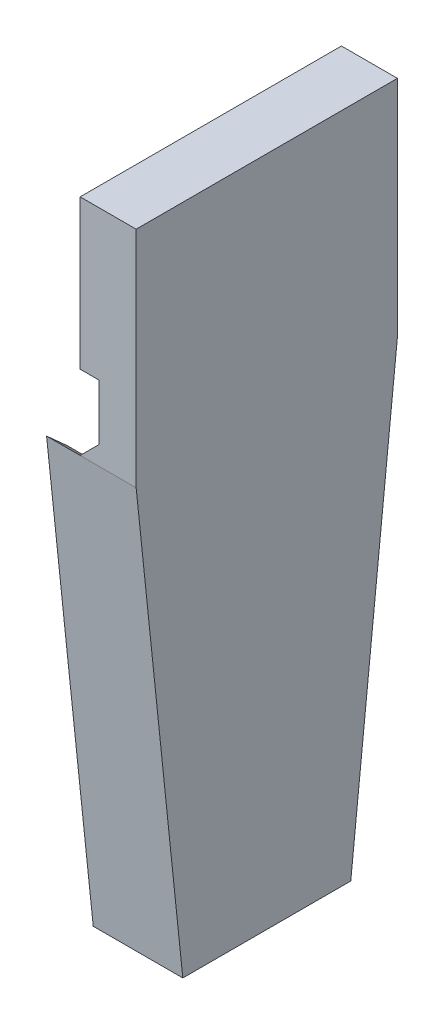
ISO-10303-21;
HEADER;
FILE_DESCRIPTION(('STEP AP214'),'2;1');
FILE_NAME('part.step','',(''),(''),'','','');
FILE_SCHEMA(('AUTOMOTIVE_DESIGN { 1 0 10303 214 1 1 1 1 }'));
ENDSEC;
DATA;
#1=APPLICATION_CONTEXT('core data for automotive mechanical design processes');
#2=APPLICATION_PROTOCOL_DEFINITION('international standard','automotive_design',2000,#1);
#3=PRODUCT_CONTEXT('',#1,'mechanical');
#4=PRODUCT('Part','Part','',(#3));
#5=PRODUCT_RELATED_PRODUCT_CATEGORY('part','',(#4));
#6=PRODUCT_DEFINITION_FORMATION('','',#4);
#7=PRODUCT_DEFINITION_CONTEXT('part definition',#1,'design');
#8=PRODUCT_DEFINITION('design','',#6,#7);
#9=PRODUCT_DEFINITION_SHAPE('','',#8);
#10=(LENGTH_UNIT() NAMED_UNIT(*) SI_UNIT(.MILLI.,.METRE.));
#11=(NAMED_UNIT(*) PLANE_ANGLE_UNIT() SI_UNIT($,.RADIAN.));
#12=(NAMED_UNIT(*) SI_UNIT($,.STERADIAN.) SOLID_ANGLE_UNIT());
#13=UNCERTAINTY_MEASURE_WITH_UNIT(LENGTH_MEASURE(1.E-05),#10,'distance_accuracy_value','');
#14=(GEOMETRIC_REPRESENTATION_CONTEXT(3) GLOBAL_UNCERTAINTY_ASSIGNED_CONTEXT((#13)) GLOBAL_UNIT_ASSIGNED_CONTEXT((#10,
#11,#12)) REPRESENTATION_CONTEXT('',''));
#15=CARTESIAN_POINT('',(0.,0.,0.));
#16=DIRECTION('',(0.,0.,1.));
#17=DIRECTION('',(1.,0.,0.));
#18=AXIS2_PLACEMENT_3D('',#15,#16,#17);
#19=CARTESIAN_POINT('',(62.2884324048631,0.,-7.00000000000001));
#20=DIRECTION('',(1.,0.,0.));
#21=DIRECTION('',(0.,0.,-1.));
#22=AXIS2_PLACEMENT_3D('',#19,#20,#21);
#23=PLANE('',#22);
#24=DIRECTION('',(0.,0.669475136110574,-0.742834464823576));
#25=VECTOR('',#24,1.);
#26=CARTESIAN_POINT('',(62.2884324048631,-5.29078718190904,-4.7682904287187));
#27=LINE('',#26,#25);
#28=CARTESIAN_POINT('',(62.2884324048631,-4.27947222582705,-5.89042262399887));
#29=VERTEX_POINT('',#28);
#30=CARTESIAN_POINT('',(62.2884324048631,-3.27947222582705,-7.00000000000001));
#31=VERTEX_POINT('',#30);
#32=EDGE_CURVE('E346',#29,#31,#27,.T.);
#33=ORIENTED_EDGE('',*,*,#32,.F.);
#34=DIRECTION('',(0.,0.994618408890778,-0.103606084259456));
#35=VECTOR('',#34,1.);
#36=CARTESIAN_POINT('',(62.2884324048631,-27.1758661415676,-3.50538159110922));
#37=LINE('',#36,#35);
#38=CARTESIAN_POINT('',(62.2884324048631,-3.27947222582706,-5.99458929066553));
#39=VERTEX_POINT('',#38);
#40=EDGE_CURVE('E394',#29,#39,#37,.T.);
#41=ORIENTED_EDGE('',*,*,#40,.T.);
#42=DIRECTION('',(0.,0.,1.));
#43=VECTOR('',#42,1.);
#44=CARTESIAN_POINT('',(62.2884324048631,-3.27947222582705,-7.00000000000001));
#45=LINE('',#44,#43);
#46=EDGE_CURVE('E461',#31,#39,#45,.T.);
#47=ORIENTED_EDGE('',*,*,#46,.F.);
#48=EDGE_LOOP('',(#33,#41,#47));
#49=FACE_BOUND('',#48,.T.);
#50=ADVANCED_FACE('F144',(#49),#23,.F.);
#51=DIRECTION('',(0.,-0.669475136110574,-0.742834464823576));
#52=VECTOR('',#51,1.);
#53=CARTESIAN_POINT('',(62.2884324048631,-5.29078718190904,4.7682904287187));
#54=LINE('',#53,#52);
#55=CARTESIAN_POINT('',(62.2884324048631,-3.27947222582705,7.));
#56=VERTEX_POINT('',#55);
#57=CARTESIAN_POINT('',(62.2884324048631,-4.27947222582705,5.89042262399886));
#58=VERTEX_POINT('',#57);
#59=EDGE_CURVE('E326',#56,#58,#54,.T.);
#60=ORIENTED_EDGE('',*,*,#59,.F.);
#61=CARTESIAN_POINT('',(62.2884324048631,-3.27947222582705,5.99458929066552));
#62=VERTEX_POINT('',#61);
#63=EDGE_CURVE('E452',#62,#56,#45,.T.);
#64=ORIENTED_EDGE('',*,*,#63,.F.);
#65=DIRECTION('',(0.,-0.994618408890778,-0.103606084259456));
#66=VECTOR('',#65,1.);
#67=CARTESIAN_POINT('',(62.2884324048631,-3.17586614156759,6.00538159110922));
#68=LINE('',#67,#66);
#69=EDGE_CURVE('E159',#62,#58,#68,.T.);
#70=ORIENTED_EDGE('',*,*,#69,.T.);
#71=EDGE_LOOP('',(#60,#64,#70));
#72=FACE_BOUND('',#71,.T.);
#73=ADVANCED_FACE('F513',(#72),#23,.F.);
#74=CARTESIAN_POINT('',(0.,6.72052777417295,-7.00000000000001));
#75=DIRECTION('',(0.,1.,0.));
#76=DIRECTION('',(0.,0.,1.));
#77=AXIS2_PLACEMENT_3D('',#74,#75,#76);
#78=PLANE('',#77);
#79=DIRECTION('',(1.,0.,0.));
#80=VECTOR('',#79,1.);
#81=CARTESIAN_POINT('',(62.2884324048631,6.72052777417295,6.));
#82=LINE('',#81,#80);
#83=CARTESIAN_POINT('',(62.2884324048631,6.72052777417295,6.));
#84=VERTEX_POINT('',#83);
#85=CARTESIAN_POINT('',(63.2884324048631,6.72052777417295,6.));
#86=VERTEX_POINT('',#85);
#87=EDGE_CURVE('E373',#84,#86,#82,.T.);
#88=ORIENTED_EDGE('',*,*,#87,.F.);
#89=DIRECTION('',(0.,0.,1.));
#90=VECTOR('',#89,1.);
#91=CARTESIAN_POINT('',(62.2884324048631,6.72052777417295,0.));
#92=LINE('',#91,#90);
#93=CARTESIAN_POINT('',(62.2884324048631,6.72052777417295,-6.00000000000001));
#94=VERTEX_POINT('',#93);
#95=EDGE_CURVE('E12',#94,#84,#92,.T.);
#96=ORIENTED_EDGE('',*,*,#95,.F.);
#97=DIRECTION('',(1.,0.,0.));
#98=VECTOR('',#97,1.);
#99=CARTESIAN_POINT('',(62.2884324048631,6.72052777417295,-6.00000000000001));
#100=LINE('',#99,#98);
#101=CARTESIAN_POINT('',(63.2884324048631,6.72052777417295,-6.00000000000001));
#102=VERTEX_POINT('',#101);
#103=EDGE_CURVE('E389',#94,#102,#100,.T.);
#104=ORIENTED_EDGE('',*,*,#103,.T.);
#105=DIRECTION('',(0.,0.,1.));
#106=VECTOR('',#105,1.);
#107=CARTESIAN_POINT('',(63.2884324048631,6.72052777417295,-7.00000000000001));
#108=LINE('',#107,#106);
#109=EDGE_CURVE('E453',#102,#86,#108,.T.);
#110=ORIENTED_EDGE('',*,*,#109,.T.);
#111=EDGE_LOOP('',(#88,#96,#104,#110));
#112=FACE_BOUND('',#111,.T.);
#113=ADVANCED_FACE('F515',(#112),#78,.F.);
#114=CARTESIAN_POINT('',(63.2884324048631,0.,-7.00000000000001));
#115=DIRECTION('',(1.,0.,0.));
#116=DIRECTION('',(0.,0.,-1.));
#117=AXIS2_PLACEMENT_3D('',#114,#115,#116);
#118=PLANE('',#117);
#119=DIRECTION('',(0.,0.970142500145332,0.242535625036333));
#120=VECTOR('',#119,1.);
#121=CARTESIAN_POINT('',(63.2884324048631,1.68944281024547,-6.75777124098188));
#122=LINE('',#121,#120);
#123=CARTESIAN_POINT('',(63.2884324048631,0.72052777417295,-7.00000000000001));
#124=VERTEX_POINT('',#123);
#125=CARTESIAN_POINT('',(63.2884324048631,4.72052777417295,-6.));
#126=VERTEX_POINT('',#125);
#127=EDGE_CURVE('E375',#124,#126,#122,.T.);
#128=ORIENTED_EDGE('',*,*,#127,.F.);
#129=DIRECTION('',(0.,1.,0.));
#130=VECTOR('',#129,1.);
#131=CARTESIAN_POINT('',(63.2884324048631,0.,-7.00000000000001));
#132=LINE('',#131,#130);
#133=CARTESIAN_POINT('',(63.2884324048631,-2.27947222582706,-7.00000000000001));
#134=VERTEX_POINT('',#133);
#135=EDGE_CURVE('E449',#134,#124,#132,.T.);
#136=ORIENTED_EDGE('',*,*,#135,.F.);
#137=DIRECTION('',(0.,0.,1.));
#138=VECTOR('',#137,1.);
#139=CARTESIAN_POINT('',(63.2884324048631,-2.27947222582706,-7.00000000000001));
#140=LINE('',#139,#138);
#141=CARTESIAN_POINT('',(63.2884324048631,-2.27947222582706,-6.));
#142=VERTEX_POINT('',#141);
#143=EDGE_CURVE('E457',#134,#142,#140,.T.);
#144=ORIENTED_EDGE('',*,*,#143,.T.);
#145=DIRECTION('',(0.,1.,0.));
#146=VECTOR('',#145,1.);
#147=CARTESIAN_POINT('',(63.2884324048631,0.,-6.));
#148=LINE('',#147,#146);
#149=EDGE_CURVE('E427',#142,#126,#148,.T.);
#150=ORIENTED_EDGE('',*,*,#149,.T.);
#151=EDGE_LOOP('',(#128,#136,#144,#150));
#152=FACE_BOUND('',#151,.T.);
#153=ADVANCED_FACE('F521',(#152),#118,.F.);
#154=DIRECTION('',(0.,1.,0.));
#155=VECTOR('',#154,1.);
#156=CARTESIAN_POINT('',(63.2884324048631,0.,7.));
#157=LINE('',#156,#155);
#158=CARTESIAN_POINT('',(63.2884324048631,-2.27947222582706,7.));
#159=VERTEX_POINT('',#158);
#160=CARTESIAN_POINT('',(63.2884324048631,0.72052777417295,7.));
#161=VERTEX_POINT('',#160);
#162=EDGE_CURVE('E443',#159,#161,#157,.T.);
#163=ORIENTED_EDGE('',*,*,#162,.T.);
#164=DIRECTION('',(0.,0.970142500145332,-0.242535625036333));
#165=VECTOR('',#164,1.);
#166=CARTESIAN_POINT('',(63.2884324048631,1.68944281024547,6.75777124098187));
#167=LINE('',#166,#165);
#168=CARTESIAN_POINT('',(63.2884324048631,4.72052777417296,6.));
#169=VERTEX_POINT('',#168);
#170=EDGE_CURVE('E361',#161,#169,#167,.T.);
#171=ORIENTED_EDGE('',*,*,#170,.T.);
#172=DIRECTION('',(0.,1.,0.));
#173=VECTOR('',#172,1.);
#174=CARTESIAN_POINT('',(63.2884324048631,0.,6.));
#175=LINE('',#174,#173);
#176=CARTESIAN_POINT('',(63.2884324048631,-2.27947222582706,6.));
#177=VERTEX_POINT('',#176);
#178=EDGE_CURVE('E419',#177,#169,#175,.T.);
#179=ORIENTED_EDGE('',*,*,#178,.F.);
#180=EDGE_CURVE('E460',#177,#159,#140,.T.);
#181=ORIENTED_EDGE('',*,*,#180,.T.);
#182=EDGE_LOOP('',(#163,#171,#179,#181));
#183=FACE_BOUND('',#182,.T.);
#184=ADVANCED_FACE('F558',(#183),#118,.F.);
#185=CARTESIAN_POINT('',(32.783952315345,-32.7839523153451,-7.00000000000001));
#186=DIRECTION('',(0.707106781186546,-0.707106781186549,0.));
#187=DIRECTION('',(0.707106781186549,0.707106781186546,0.));
#188=AXIS2_PLACEMENT_3D('',#185,#186,#187);
#189=PLANE('',#188);
#190=DIRECTION('',(0.705196401132398,0.705196401132395,0.0734579584512911));
#191=VECTOR('',#190,1.);
#192=CARTESIAN_POINT('',(32.27001114817,-33.2978934825201,2.86767040976001));
#193=LINE('',#192,#191);
#194=CARTESIAN_POINT('',(62.340375214474,-3.22752941621612,6.));
#195=VERTEX_POINT('',#194);
#196=EDGE_CURVE('E438',#62,#195,#193,.T.);
#197=ORIENTED_EDGE('',*,*,#196,.F.);
#198=ORIENTED_EDGE('',*,*,#63,.T.);
#199=DIRECTION('',(0.707106781186549,0.707106781186546,0.));
#200=VECTOR('',#199,1.);
#201=CARTESIAN_POINT('',(32.783952315345,-32.7839523153451,7.));
#202=LINE('',#201,#200);
#203=EDGE_CURVE('E440',#56,#159,#202,.T.);
#204=ORIENTED_EDGE('',*,*,#203,.T.);
#205=ORIENTED_EDGE('',*,*,#180,.F.);
#206=DIRECTION('',(0.707106781186549,0.707106781186546,0.));
#207=VECTOR('',#206,1.);
#208=CARTESIAN_POINT('',(32.783952315345,-32.7839523153451,5.99999999999999));
#209=LINE('',#208,#207);
#210=EDGE_CURVE('E391',#195,#177,#209,.T.);
#211=ORIENTED_EDGE('',*,*,#210,.F.);
#212=EDGE_LOOP('',(#197,#198,#204,#205,#211));
#213=FACE_BOUND('',#212,.T.);
#214=ADVANCED_FACE('F511',(#213),#189,.F.);
#215=CARTESIAN_POINT('',(65.2884324048631,8.72052777417295,7.));
#216=DIRECTION('',(0.,0.,-1.));
#217=DIRECTION('',(0.,1.,0.));
#218=AXIS2_PLACEMENT_3D('',#215,#216,#217);
#219=PLANE('',#218);
#220=DIRECTION('',(0.,-1.,0.));
#221=VECTOR('',#220,1.);
#222=CARTESIAN_POINT('',(62.2884324048631,8.72052777417295,7.));
#223=LINE('',#222,#221);
#224=CARTESIAN_POINT('',(62.2884324048631,8.72052777417295,7.));
#225=VERTEX_POINT('',#224);
#226=CARTESIAN_POINT('',(62.2884324048631,0.72052777417295,7.));
#227=VERTEX_POINT('',#226);
#228=EDGE_CURVE('E456',#225,#227,#223,.T.);
#229=ORIENTED_EDGE('',*,*,#228,.T.);
#230=DIRECTION('',(1.,0.,0.));
#231=VECTOR('',#230,1.);
#232=CARTESIAN_POINT('',(62.2884324048631,0.72052777417295,7.));
#233=LINE('',#232,#231);
#234=EDGE_CURVE('E367',#227,#161,#233,.T.);
#235=ORIENTED_EDGE('',*,*,#234,.T.);
#236=ORIENTED_EDGE('',*,*,#162,.F.);
#237=ORIENTED_EDGE('',*,*,#203,.F.);
#238=DIRECTION('',(-1.,0.,0.));
#239=VECTOR('',#238,1.);
#240=CARTESIAN_POINT('',(65.2884324048631,-3.27947222582705,7.));
#241=LINE('',#240,#239);
#242=CARTESIAN_POINT('',(65.2884324048631,-3.27947222582705,7.));
#243=VERTEX_POINT('',#242);
#244=EDGE_CURVE('E152',#243,#56,#241,.T.);
#245=ORIENTED_EDGE('',*,*,#244,.F.);
#246=DIRECTION('',(0.,-1.,0.));
#247=VECTOR('',#246,1.);
#248=CARTESIAN_POINT('',(65.2884324048631,8.72052777417295,7.));
#249=LINE('',#248,#247);
#250=CARTESIAN_POINT('',(65.2884324048631,8.72052777417295,7.));
#251=VERTEX_POINT('',#250);
#252=EDGE_CURVE('E464',#251,#243,#249,.T.);
#253=ORIENTED_EDGE('',*,*,#252,.F.);
#254=DIRECTION('',(-1.,0.,0.));
#255=VECTOR('',#254,1.);
#256=CARTESIAN_POINT('',(65.2884324048631,8.72052777417295,7.));
#257=LINE('',#256,#255);
#258=EDGE_CURVE('E480',#251,#225,#257,.T.);
#259=ORIENTED_EDGE('',*,*,#258,.T.);
#260=EDGE_LOOP('',(#229,#235,#236,#237,#245,#253,#259));
#261=FACE_BOUND('',#260,.T.);
#262=ADVANCED_FACE('F146',(#261),#219,.F.);
#263=CARTESIAN_POINT('',(65.2884324048631,-3.27947222582705,7.));
#264=DIRECTION('',(0.,0.103606084259456,-0.994618408890778));
#265=DIRECTION('',(0.,0.994618408890778,0.103606084259456));
#266=AXIS2_PLACEMENT_3D('',#263,#264,#265);
#267=PLANE('',#266);
#268=ORIENTED_EDGE('',*,*,#244,.T.);
#269=DIRECTION('',(1.,0.,0.));
#270=VECTOR('',#269,1.);
#271=CARTESIAN_POINT('',(60.4884324048631,-3.27947222582705,7.));
#272=LINE('',#271,#270);
#273=CARTESIAN_POINT('',(60.4884324048631,-3.27947222582705,7.));
#274=VERTEX_POINT('',#273);
#275=EDGE_CURVE('E352',#274,#56,#272,.T.);
#276=ORIENTED_EDGE('',*,*,#275,.F.);
#277=DIRECTION('',(0.,0.994618408890778,0.103606084259456));
#278=VECTOR('',#277,1.);
#279=CARTESIAN_POINT('',(60.4884324048631,-0.756542209379851,7.26280521004658));
#280=LINE('',#279,#278);
#281=CARTESIAN_POINT('',(60.4884324048631,-27.279472225827,4.5));
#282=VERTEX_POINT('',#281);
#283=EDGE_CURVE('E342',#282,#274,#280,.T.);
#284=ORIENTED_EDGE('',*,*,#283,.F.);
#285=DIRECTION('',(-1.,0.,0.));
#286=VECTOR('',#285,1.);
#287=CARTESIAN_POINT('',(65.2884324048631,-27.279472225827,4.5));
#288=LINE('',#287,#286);
#289=CARTESIAN_POINT('',(65.2884324048631,-27.279472225827,4.5));
#290=VERTEX_POINT('',#289);
#291=EDGE_CURVE('E494',#290,#282,#288,.T.);
#292=ORIENTED_EDGE('',*,*,#291,.F.);
#293=DIRECTION('',(0.,-0.994618408890778,-0.103606084259456));
#294=VECTOR('',#293,1.);
#295=CARTESIAN_POINT('',(65.2884324048631,-3.27947222582705,7.));
#296=LINE('',#295,#294);
#297=EDGE_CURVE('E467',#243,#290,#296,.T.);
#298=ORIENTED_EDGE('',*,*,#297,.F.);
#299=EDGE_LOOP('',(#268,#276,#284,#292,#298));
#300=FACE_BOUND('',#299,.T.);
#301=ADVANCED_FACE('F499',(#300),#267,.F.);
#302=CARTESIAN_POINT('',(65.2884324048631,-27.279472225827,4.5));
#303=DIRECTION('',(0.,1.,0.));
#304=DIRECTION('',(0.,0.,1.));
#305=AXIS2_PLACEMENT_3D('',#302,#303,#304);
#306=PLANE('',#305);
#307=ORIENTED_EDGE('',*,*,#291,.T.);
#308=DIRECTION('',(0.,0.,1.));
#309=VECTOR('',#308,1.);
#310=CARTESIAN_POINT('',(60.4884324048631,-27.279472225827,0.));
#311=LINE('',#310,#309);
#312=CARTESIAN_POINT('',(60.4884324048631,-27.279472225827,-4.5));
#313=VERTEX_POINT('',#312);
#314=EDGE_CURVE('E339',#313,#282,#311,.T.);
#315=ORIENTED_EDGE('',*,*,#314,.F.);
#316=DIRECTION('',(-1.,0.,0.));
#317=VECTOR('',#316,1.);
#318=CARTESIAN_POINT('',(65.2884324048631,-27.279472225827,-4.5));
#319=LINE('',#318,#317);
#320=CARTESIAN_POINT('',(65.2884324048631,-27.279472225827,-4.5));
#321=VERTEX_POINT('',#320);
#322=EDGE_CURVE('E492',#321,#313,#319,.T.);
#323=ORIENTED_EDGE('',*,*,#322,.F.);
#324=DIRECTION('',(0.,0.,-1.));
#325=VECTOR('',#324,1.);
#326=CARTESIAN_POINT('',(65.2884324048631,-27.279472225827,4.5));
#327=LINE('',#326,#325);
#328=EDGE_CURVE('E470',#290,#321,#327,.T.);
#329=ORIENTED_EDGE('',*,*,#328,.F.);
#330=EDGE_LOOP('',(#307,#315,#323,#329));
#331=FACE_BOUND('',#330,.T.);
#332=ADVANCED_FACE('F547',(#331),#306,.F.);
#333=CARTESIAN_POINT('',(65.2884324048631,-27.279472225827,-4.5));
#334=DIRECTION('',(0.,0.103606084259456,0.994618408890778));
#335=DIRECTION('',(0.,-0.994618408890778,0.103606084259456));
#336=AXIS2_PLACEMENT_3D('',#333,#334,#335);
#337=PLANE('',#336);
#338=ORIENTED_EDGE('',*,*,#322,.T.);
#339=DIRECTION('',(0.,-0.994618408890778,0.103606084259456));
#340=VECTOR('',#339,1.);
#341=CARTESIAN_POINT('',(60.4884324048631,-0.756542209379854,-7.26280521004659));
#342=LINE('',#341,#340);
#343=CARTESIAN_POINT('',(60.4884324048631,-3.27947222582705,-7.));
#344=VERTEX_POINT('',#343);
#345=EDGE_CURVE('E336',#344,#313,#342,.T.);
#346=ORIENTED_EDGE('',*,*,#345,.F.);
#347=DIRECTION('',(1.,0.,0.));
#348=VECTOR('',#347,1.);
#349=CARTESIAN_POINT('',(60.4884324048631,-3.27947222582705,-7.));
#350=LINE('',#349,#348);
#351=EDGE_CURVE('E355',#344,#31,#350,.T.);
#352=ORIENTED_EDGE('',*,*,#351,.T.);
#353=DIRECTION('',(-1.,0.,0.));
#354=VECTOR('',#353,1.);
#355=CARTESIAN_POINT('',(65.2884324048631,-3.27947222582705,-7.));
#356=LINE('',#355,#354);
#357=CARTESIAN_POINT('',(65.2884324048631,-3.27947222582705,-7.));
#358=VERTEX_POINT('',#357);
#359=EDGE_CURVE('E489',#358,#31,#356,.T.);
#360=ORIENTED_EDGE('',*,*,#359,.F.);
#361=DIRECTION('',(0.,0.994618408890778,-0.103606084259456));
#362=VECTOR('',#361,1.);
#363=CARTESIAN_POINT('',(65.2884324048631,-27.279472225827,-4.5));
#364=LINE('',#363,#362);
#365=EDGE_CURVE('E472',#321,#358,#364,.T.);
#366=ORIENTED_EDGE('',*,*,#365,.F.);
#367=EDGE_LOOP('',(#338,#346,#352,#360,#366));
#368=FACE_BOUND('',#367,.T.);
#369=ADVANCED_FACE('F543',(#368),#337,.F.);
#370=CARTESIAN_POINT('',(65.2884324048631,8.72052777417295,-7.));
#371=DIRECTION('',(0.,0.,-1.));
#372=DIRECTION('',(0.,1.,0.));
#373=AXIS2_PLACEMENT_3D('',#370,#371,#372);
#374=PLANE('',#373);
#375=DIRECTION('',(1.,0.,0.));
#376=VECTOR('',#375,1.);
#377=CARTESIAN_POINT('',(62.2884324048631,0.720527774172953,-7.00000000000001));
#378=LINE('',#377,#376);
#379=CARTESIAN_POINT('',(62.2884324048631,0.720527774172953,-7.00000000000001));
#380=VERTEX_POINT('',#379);
#381=EDGE_CURVE('E386',#380,#124,#378,.T.);
#382=ORIENTED_EDGE('',*,*,#381,.F.);
#383=DIRECTION('',(0.,-1.,0.));
#384=VECTOR('',#383,1.);
#385=CARTESIAN_POINT('',(62.2884324048631,8.72052777417295,-7.));
#386=LINE('',#385,#384);
#387=CARTESIAN_POINT('',(62.2884324048631,8.72052777417295,-7.));
#388=VERTEX_POINT('',#387);
#389=EDGE_CURVE('E482',#388,#380,#386,.T.);
#390=ORIENTED_EDGE('',*,*,#389,.F.);
#391=DIRECTION('',(-1.,0.,0.));
#392=VECTOR('',#391,1.);
#393=CARTESIAN_POINT('',(65.2884324048631,8.72052777417295,-7.));
#394=LINE('',#393,#392);
#395=CARTESIAN_POINT('',(65.2884324048631,8.72052777417295,-7.));
#396=VERTEX_POINT('',#395);
#397=EDGE_CURVE('E487',#396,#388,#394,.T.);
#398=ORIENTED_EDGE('',*,*,#397,.F.);
#399=DIRECTION('',(0.,-1.,0.));
#400=VECTOR('',#399,1.);
#401=CARTESIAN_POINT('',(65.2884324048631,8.72052777417295,-7.));
#402=LINE('',#401,#400);
#403=EDGE_CURVE('E474',#396,#358,#402,.T.);
#404=ORIENTED_EDGE('',*,*,#403,.T.);
#405=ORIENTED_EDGE('',*,*,#359,.T.);
#406=DIRECTION('',(0.707106781186549,0.707106781186546,0.));
#407=VECTOR('',#406,1.);
#408=CARTESIAN_POINT('',(32.783952315345,-32.7839523153451,-7.00000000000001));
#409=LINE('',#408,#407);
#410=EDGE_CURVE('E446',#31,#134,#409,.T.);
#411=ORIENTED_EDGE('',*,*,#410,.T.);
#412=ORIENTED_EDGE('',*,*,#135,.T.);
#413=EDGE_LOOP('',(#382,#390,#398,#404,#405,#411,#412));
#414=FACE_BOUND('',#413,.T.);
#415=ADVANCED_FACE('F539',(#414),#374,.T.);
#416=CARTESIAN_POINT('',(65.2884324048631,8.72052777417295,7.));
#417=DIRECTION('',(0.,1.,0.));
#418=DIRECTION('',(0.,0.,1.));
#419=AXIS2_PLACEMENT_3D('',#416,#417,#418);
#420=PLANE('',#419);
#421=DIRECTION('',(0.,0.,-1.));
#422=VECTOR('',#421,1.);
#423=CARTESIAN_POINT('',(62.2884324048631,8.72052777417295,7.));
#424=LINE('',#423,#422);
#425=EDGE_CURVE('E468',#225,#388,#424,.T.);
#426=ORIENTED_EDGE('',*,*,#425,.F.);
#427=ORIENTED_EDGE('',*,*,#258,.F.);
#428=DIRECTION('',(0.,0.,-1.));
#429=VECTOR('',#428,1.);
#430=CARTESIAN_POINT('',(65.2884324048631,8.72052777417295,7.));
#431=LINE('',#430,#429);
#432=EDGE_CURVE('E477',#251,#396,#431,.T.);
#433=ORIENTED_EDGE('',*,*,#432,.T.);
#434=ORIENTED_EDGE('',*,*,#397,.T.);
#435=EDGE_LOOP('',(#426,#427,#433,#434));
#436=FACE_BOUND('',#435,.T.);
#437=ADVANCED_FACE('F532',(#436),#420,.T.);
#438=CARTESIAN_POINT('',(65.2884324048631,0.,0.));
#439=DIRECTION('',(1.,0.,0.));
#440=DIRECTION('',(0.,0.,-1.));
#441=AXIS2_PLACEMENT_3D('',#438,#439,#440);
#442=PLANE('',#441);
#443=ORIENTED_EDGE('',*,*,#252,.T.);
#444=ORIENTED_EDGE('',*,*,#297,.T.);
#445=ORIENTED_EDGE('',*,*,#328,.T.);
#446=ORIENTED_EDGE('',*,*,#365,.T.);
#447=ORIENTED_EDGE('',*,*,#403,.F.);
#448=ORIENTED_EDGE('',*,*,#432,.F.);
#449=EDGE_LOOP('',(#443,#444,#445,#446,#447,#448));
#450=FACE_BOUND('',#449,.T.);
#451=ADVANCED_FACE('F528',(#450),#442,.T.);
#452=CARTESIAN_POINT('',(62.2884324048631,0.,0.));
#453=DIRECTION('',(1.,0.,0.));
#454=DIRECTION('',(0.,0.,-1.));
#455=AXIS2_PLACEMENT_3D('',#452,#453,#454);
#456=PLANE('',#455);
#457=ORIENTED_EDGE('',*,*,#389,.T.);
#458=DIRECTION('',(0.,0.970142500145332,0.242535625036333));
#459=VECTOR('',#458,1.);
#460=CARTESIAN_POINT('',(62.2884324048631,1.68944281024547,-6.75777124098188));
#461=LINE('',#460,#459);
#462=CARTESIAN_POINT('',(62.2884324048631,4.72052777417295,-6.00000000000001));
#463=VERTEX_POINT('',#462);
#464=EDGE_CURVE('E379',#380,#463,#461,.T.);
#465=ORIENTED_EDGE('',*,*,#464,.T.);
#466=DIRECTION('',(0.,-1.,0.));
#467=VECTOR('',#466,1.);
#468=CARTESIAN_POINT('',(62.2884324048631,0.,-6.00000000000001));
#469=LINE('',#468,#467);
#470=EDGE_CURVE('E376',#94,#463,#469,.T.);
#471=ORIENTED_EDGE('',*,*,#470,.F.);
#472=ORIENTED_EDGE('',*,*,#95,.T.);
#473=DIRECTION('',(0.,-1.,0.));
#474=VECTOR('',#473,1.);
#475=CARTESIAN_POINT('',(62.2884324048631,0.,6.));
#476=LINE('',#475,#474);
#477=CARTESIAN_POINT('',(62.2884324048631,4.72052777417296,6.));
#478=VERTEX_POINT('',#477);
#479=EDGE_CURVE('E362',#84,#478,#476,.T.);
#480=ORIENTED_EDGE('',*,*,#479,.T.);
#481=DIRECTION('',(0.,0.970142500145332,-0.242535625036333));
#482=VECTOR('',#481,1.);
#483=CARTESIAN_POINT('',(62.2884324048631,1.68944281024547,6.75777124098187));
#484=LINE('',#483,#482);
#485=EDGE_CURVE('E364',#227,#478,#484,.T.);
#486=ORIENTED_EDGE('',*,*,#485,.F.);
#487=ORIENTED_EDGE('',*,*,#228,.F.);
#488=ORIENTED_EDGE('',*,*,#425,.T.);
#489=EDGE_LOOP('',(#457,#465,#471,#472,#480,#486,#487,#488));
#490=FACE_BOUND('',#489,.T.);
#491=ADVANCED_FACE('F531',(#490),#456,.F.);
#492=DIRECTION('',(-0.705196401132398,-0.705196401132395,0.0734579584512913));
#493=VECTOR('',#492,1.);
#494=CARTESIAN_POINT('',(32.9952431792513,-32.5726614514387,-2.94321541299765));
#495=LINE('',#494,#493);
#496=CARTESIAN_POINT('',(62.340375214474,-3.22752941621612,-6.));
#497=VERTEX_POINT('',#496);
#498=EDGE_CURVE('E433',#497,#39,#495,.T.);
#499=ORIENTED_EDGE('',*,*,#498,.F.);
#500=DIRECTION('',(0.707106781186549,0.707106781186546,0.));
#501=VECTOR('',#500,1.);
#502=CARTESIAN_POINT('',(32.783952315345,-32.7839523153451,-6.00000000000001));
#503=LINE('',#502,#501);
#504=EDGE_CURVE('E422',#497,#142,#503,.T.);
#505=ORIENTED_EDGE('',*,*,#504,.T.);
#506=ORIENTED_EDGE('',*,*,#143,.F.);
#507=ORIENTED_EDGE('',*,*,#410,.F.);
#508=ORIENTED_EDGE('',*,*,#46,.T.);
#509=EDGE_LOOP('',(#499,#505,#506,#507,#508));
#510=FACE_BOUND('',#509,.T.);
#511=ADVANCED_FACE('F526',(#510),#189,.F.);
#512=CARTESIAN_POINT('',(65.2884324048631,8.72052777417295,6.));
#513=DIRECTION('',(0.,0.,-1.));
#514=DIRECTION('',(0.,1.,0.));
#515=AXIS2_PLACEMENT_3D('',#512,#513,#514);
#516=PLANE('',#515);
#517=DIRECTION('',(-1.,0.,0.));
#518=VECTOR('',#517,1.);
#519=CARTESIAN_POINT('',(65.2884324048631,7.72052777417295,6.));
#520=LINE('',#519,#518);
#521=CARTESIAN_POINT('',(64.2884324048631,7.72052777417295,6.));
#522=VERTEX_POINT('',#521);
#523=CARTESIAN_POINT('',(63.2884324048631,7.72052777417295,6.));
#524=VERTEX_POINT('',#523);
#525=EDGE_CURVE('E398',#522,#524,#520,.T.);
#526=ORIENTED_EDGE('',*,*,#525,.F.);
#527=DIRECTION('',(0.,-1.,0.));
#528=VECTOR('',#527,1.);
#529=CARTESIAN_POINT('',(64.2884324048631,8.72052777417295,6.));
#530=LINE('',#529,#528);
#531=CARTESIAN_POINT('',(64.2884324048631,-3.22752941621612,6.));
#532=VERTEX_POINT('',#531);
#533=EDGE_CURVE('E395',#522,#532,#530,.T.);
#534=ORIENTED_EDGE('',*,*,#533,.T.);
#535=DIRECTION('',(-1.,0.,0.));
#536=VECTOR('',#535,1.);
#537=CARTESIAN_POINT('',(65.2884324048631,-3.22752941621612,6.));
#538=LINE('',#537,#536);
#539=EDGE_CURVE('E314',#532,#195,#538,.T.);
#540=ORIENTED_EDGE('',*,*,#539,.T.);
#541=ORIENTED_EDGE('',*,*,#210,.T.);
#542=ORIENTED_EDGE('',*,*,#178,.T.);
#543=DIRECTION('',(1.,0.,0.));
#544=VECTOR('',#543,1.);
#545=CARTESIAN_POINT('',(62.2884324048631,4.72052777417296,6.));
#546=LINE('',#545,#544);
#547=EDGE_CURVE('E371',#478,#169,#546,.T.);
#548=ORIENTED_EDGE('',*,*,#547,.F.);
#549=ORIENTED_EDGE('',*,*,#479,.F.);
#550=ORIENTED_EDGE('',*,*,#87,.T.);
#551=EDGE_CURVE('E423',#86,#524,#175,.T.);
#552=ORIENTED_EDGE('',*,*,#551,.T.);
#553=EDGE_LOOP('',(#526,#534,#540,#541,#542,#548,#549,#550,#552));
#554=FACE_BOUND('',#553,.T.);
#555=ADVANCED_FACE('F570',(#554),#516,.T.);
#556=CARTESIAN_POINT('',(65.2884324048631,-3.17586614156759,6.00538159110922));
#557=DIRECTION('',(0.,0.103606084259456,-0.994618408890778));
#558=DIRECTION('',(0.,0.994618408890778,0.103606084259456));
#559=AXIS2_PLACEMENT_3D('',#556,#557,#558);
#560=PLANE('',#559);
#561=ORIENTED_EDGE('',*,*,#539,.F.);
#562=DIRECTION('',(0.,-0.994618408890778,-0.103606084259456));
#563=VECTOR('',#562,1.);
#564=CARTESIAN_POINT('',(64.2884324048631,-3.17586614156759,6.00538159110922));
#565=LINE('',#564,#563);
#566=CARTESIAN_POINT('',(64.2884324048631,-26.279472225827,3.59875595733219));
#567=VERTEX_POINT('',#566);
#568=EDGE_CURVE('E310',#532,#567,#565,.T.);
#569=ORIENTED_EDGE('',*,*,#568,.T.);
#570=DIRECTION('',(-1.,0.,0.));
#571=VECTOR('',#570,1.);
#572=CARTESIAN_POINT('',(65.2884324048631,-26.279472225827,3.59875595733219));
#573=LINE('',#572,#571);
#574=CARTESIAN_POINT('',(60.4884324048631,-26.279472225827,3.5987559573322));
#575=VERTEX_POINT('',#574);
#576=EDGE_CURVE('E305',#567,#575,#573,.T.);
#577=ORIENTED_EDGE('',*,*,#576,.T.);
#578=DIRECTION('',(0.,0.994618408890778,0.103606084259456));
#579=VECTOR('',#578,1.);
#580=CARTESIAN_POINT('',(60.4884324048631,-0.652936125120396,6.2681868011558));
#581=LINE('',#580,#579);
#582=CARTESIAN_POINT('',(60.4884324048631,-4.27947222582705,5.89042262399886));
#583=VERTEX_POINT('',#582);
#584=EDGE_CURVE('E309',#575,#583,#581,.T.);
#585=ORIENTED_EDGE('',*,*,#584,.T.);
#586=DIRECTION('',(1.,0.,0.));
#587=VECTOR('',#586,1.);
#588=CARTESIAN_POINT('',(60.4884324048631,-4.27947222582705,5.89042262399886));
#589=LINE('',#588,#587);
#590=EDGE_CURVE('E345',#583,#58,#589,.T.);
#591=ORIENTED_EDGE('',*,*,#590,.T.);
#592=ORIENTED_EDGE('',*,*,#69,.F.);
#593=ORIENTED_EDGE('',*,*,#196,.T.);
#594=EDGE_LOOP('',(#561,#569,#577,#585,#591,#592,#593));
#595=FACE_BOUND('',#594,.T.);
#596=ADVANCED_FACE('F308',(#595),#560,.T.);
#597=CARTESIAN_POINT('',(65.2884324048631,-26.279472225827,4.5));
#598=DIRECTION('',(0.,1.,0.));
#599=DIRECTION('',(0.,0.,1.));
#600=AXIS2_PLACEMENT_3D('',#597,#598,#599);
#601=PLANE('',#600);
#602=ORIENTED_EDGE('',*,*,#576,.F.);
#603=DIRECTION('',(0.,0.,-1.));
#604=VECTOR('',#603,1.);
#605=CARTESIAN_POINT('',(64.2884324048631,-26.279472225827,4.5));
#606=LINE('',#605,#604);
#607=CARTESIAN_POINT('',(64.2884324048631,-26.279472225827,-3.5987559573322));
#608=VERTEX_POINT('',#607);
#609=EDGE_CURVE('E404',#567,#608,#606,.T.);
#610=ORIENTED_EDGE('',*,*,#609,.T.);
#611=DIRECTION('',(-1.,0.,0.));
#612=VECTOR('',#611,1.);
#613=CARTESIAN_POINT('',(65.2884324048631,-26.279472225827,-3.5987559573322));
#614=LINE('',#613,#612);
#615=CARTESIAN_POINT('',(60.4884324048631,-26.279472225827,-3.5987559573322));
#616=VERTEX_POINT('',#615);
#617=EDGE_CURVE('E315',#608,#616,#614,.T.);
#618=ORIENTED_EDGE('',*,*,#617,.T.);
#619=DIRECTION('',(0.,0.,1.));
#620=VECTOR('',#619,1.);
#621=CARTESIAN_POINT('',(60.4884324048631,-26.279472225827,0.));
#622=LINE('',#621,#620);
#623=EDGE_CURVE('E321',#616,#575,#622,.T.);
#624=ORIENTED_EDGE('',*,*,#623,.T.);
#625=EDGE_LOOP('',(#602,#610,#618,#624));
#626=FACE_BOUND('',#625,.T.);
#627=ADVANCED_FACE('F328',(#626),#601,.T.);
#628=CARTESIAN_POINT('',(65.2884324048631,-27.1758661415676,-3.50538159110922));
#629=DIRECTION('',(0.,0.103606084259456,0.994618408890778));
#630=DIRECTION('',(0.,-0.994618408890778,0.103606084259456));
#631=AXIS2_PLACEMENT_3D('',#628,#629,#630);
#632=PLANE('',#631);
#633=ORIENTED_EDGE('',*,*,#617,.F.);
#634=DIRECTION('',(0.,0.994618408890778,-0.103606084259456));
#635=VECTOR('',#634,1.);
#636=CARTESIAN_POINT('',(64.2884324048631,-27.1758661415676,-3.50538159110922));
#637=LINE('',#636,#635);
#638=CARTESIAN_POINT('',(64.2884324048631,-3.22752941621613,-6.));
#639=VERTEX_POINT('',#638);
#640=EDGE_CURVE('E408',#608,#639,#637,.T.);
#641=ORIENTED_EDGE('',*,*,#640,.T.);
#642=DIRECTION('',(-1.,0.,0.));
#643=VECTOR('',#642,1.);
#644=CARTESIAN_POINT('',(65.2884324048631,-3.22752941621613,-6.));
#645=LINE('',#644,#643);
#646=EDGE_CURVE('E406',#639,#497,#645,.T.);
#647=ORIENTED_EDGE('',*,*,#646,.T.);
#648=ORIENTED_EDGE('',*,*,#498,.T.);
#649=ORIENTED_EDGE('',*,*,#40,.F.);
#650=DIRECTION('',(1.,0.,0.));
#651=VECTOR('',#650,1.);
#652=CARTESIAN_POINT('',(60.4884324048631,-4.27947222582705,-5.89042262399887));
#653=LINE('',#652,#651);
#654=CARTESIAN_POINT('',(60.4884324048631,-4.27947222582705,-5.89042262399887));
#655=VERTEX_POINT('',#654);
#656=EDGE_CURVE('E358',#655,#29,#653,.T.);
#657=ORIENTED_EDGE('',*,*,#656,.F.);
#658=DIRECTION('',(0.,-0.994618408890778,0.103606084259456));
#659=VECTOR('',#658,1.);
#660=CARTESIAN_POINT('',(60.4884324048631,-0.652936125120399,-6.26818680115581));
#661=LINE('',#660,#659);
#662=EDGE_CURVE('E330',#655,#616,#661,.T.);
#663=ORIENTED_EDGE('',*,*,#662,.T.);
#664=EDGE_LOOP('',(#633,#641,#647,#648,#649,#657,#663));
#665=FACE_BOUND('',#664,.T.);
#666=ADVANCED_FACE('F591',(#665),#632,.T.);
#667=CARTESIAN_POINT('',(65.2884324048631,8.72052777417295,-6.));
#668=DIRECTION('',(0.,0.,-1.));
#669=DIRECTION('',(0.,1.,0.));
#670=AXIS2_PLACEMENT_3D('',#667,#668,#669);
#671=PLANE('',#670);
#672=ORIENTED_EDGE('',*,*,#149,.F.);
#673=ORIENTED_EDGE('',*,*,#504,.F.);
#674=ORIENTED_EDGE('',*,*,#646,.F.);
#675=DIRECTION('',(0.,-1.,0.));
#676=VECTOR('',#675,1.);
#677=CARTESIAN_POINT('',(64.2884324048631,8.72052777417295,-6.));
#678=LINE('',#677,#676);
#679=CARTESIAN_POINT('',(64.2884324048631,7.72052777417295,-6.));
#680=VERTEX_POINT('',#679);
#681=EDGE_CURVE('E412',#680,#639,#678,.T.);
#682=ORIENTED_EDGE('',*,*,#681,.F.);
#683=DIRECTION('',(-1.,0.,0.));
#684=VECTOR('',#683,1.);
#685=CARTESIAN_POINT('',(65.2884324048631,7.72052777417295,-6.));
#686=LINE('',#685,#684);
#687=CARTESIAN_POINT('',(63.2884324048631,7.72052777417295,-6.));
#688=VERTEX_POINT('',#687);
#689=EDGE_CURVE('E400',#680,#688,#686,.T.);
#690=ORIENTED_EDGE('',*,*,#689,.T.);
#691=EDGE_CURVE('E429',#102,#688,#148,.T.);
#692=ORIENTED_EDGE('',*,*,#691,.F.);
#693=ORIENTED_EDGE('',*,*,#103,.F.);
#694=ORIENTED_EDGE('',*,*,#470,.T.);
#695=DIRECTION('',(1.,0.,0.));
#696=VECTOR('',#695,1.);
#697=CARTESIAN_POINT('',(62.2884324048631,4.72052777417295,-6.00000000000001));
#698=LINE('',#697,#696);
#699=EDGE_CURVE('E381',#463,#126,#698,.T.);
#700=ORIENTED_EDGE('',*,*,#699,.T.);
#701=EDGE_LOOP('',(#672,#673,#674,#682,#690,#692,#693,#694,#700));
#702=FACE_BOUND('',#701,.T.);
#703=ADVANCED_FACE('F587',(#702),#671,.F.);
#704=CARTESIAN_POINT('',(65.2884324048631,7.72052777417295,7.));
#705=DIRECTION('',(0.,1.,0.));
#706=DIRECTION('',(0.,0.,1.));
#707=AXIS2_PLACEMENT_3D('',#704,#705,#706);
#708=PLANE('',#707);
#709=DIRECTION('',(0.,0.,1.));
#710=VECTOR('',#709,1.);
#711=CARTESIAN_POINT('',(63.2884324048631,7.72052777417295,-7.00000000000001));
#712=LINE('',#711,#710);
#713=EDGE_CURVE('E424',#688,#524,#712,.T.);
#714=ORIENTED_EDGE('',*,*,#713,.F.);
#715=ORIENTED_EDGE('',*,*,#689,.F.);
#716=DIRECTION('',(0.,0.,-1.));
#717=VECTOR('',#716,1.);
#718=CARTESIAN_POINT('',(64.2884324048631,7.72052777417295,7.));
#719=LINE('',#718,#717);
#720=EDGE_CURVE('E401',#522,#680,#719,.T.);
#721=ORIENTED_EDGE('',*,*,#720,.F.);
#722=ORIENTED_EDGE('',*,*,#525,.T.);
#723=EDGE_LOOP('',(#714,#715,#721,#722));
#724=FACE_BOUND('',#723,.T.);
#725=ADVANCED_FACE('F583',(#724),#708,.F.);
#726=CARTESIAN_POINT('',(64.2884324048631,0.,0.));
#727=DIRECTION('',(1.,0.,0.));
#728=DIRECTION('',(0.,0.,-1.));
#729=AXIS2_PLACEMENT_3D('',#726,#727,#728);
#730=PLANE('',#729);
#731=ORIENTED_EDGE('',*,*,#533,.F.);
#732=ORIENTED_EDGE('',*,*,#720,.T.);
#733=ORIENTED_EDGE('',*,*,#681,.T.);
#734=ORIENTED_EDGE('',*,*,#640,.F.);
#735=ORIENTED_EDGE('',*,*,#609,.F.);
#736=ORIENTED_EDGE('',*,*,#568,.F.);
#737=EDGE_LOOP('',(#731,#732,#733,#734,#735,#736));
#738=FACE_BOUND('',#737,.T.);
#739=ADVANCED_FACE('F579',(#738),#730,.F.);
#740=CARTESIAN_POINT('',(63.2884324048631,0.,-7.00000000000001));
#741=DIRECTION('',(1.,0.,0.));
#742=DIRECTION('',(0.,0.,-1.));
#743=AXIS2_PLACEMENT_3D('',#740,#741,#742);
#744=PLANE('',#743);
#745=ORIENTED_EDGE('',*,*,#691,.T.);
#746=ORIENTED_EDGE('',*,*,#713,.T.);
#747=ORIENTED_EDGE('',*,*,#551,.F.);
#748=ORIENTED_EDGE('',*,*,#109,.F.);
#749=EDGE_LOOP('',(#745,#746,#747,#748));
#750=FACE_BOUND('',#749,.T.);
#751=ADVANCED_FACE('F582',(#750),#744,.T.);
#752=CARTESIAN_POINT('',(62.2884324048631,1.68944281024547,-6.75777124098188));
#753=DIRECTION('',(0.,0.242535625036333,-0.970142500145332));
#754=DIRECTION('',(0.,0.970142500145332,0.242535625036333));
#755=AXIS2_PLACEMENT_3D('',#752,#753,#754);
#756=PLANE('',#755);
#757=ORIENTED_EDGE('',*,*,#127,.T.);
#758=ORIENTED_EDGE('',*,*,#699,.F.);
#759=ORIENTED_EDGE('',*,*,#464,.F.);
#760=ORIENTED_EDGE('',*,*,#381,.T.);
#761=EDGE_LOOP('',(#757,#758,#759,#760));
#762=FACE_BOUND('',#761,.T.);
#763=ADVANCED_FACE('F604',(#762),#756,.F.);
#764=CARTESIAN_POINT('',(62.2884324048631,1.68944281024547,6.75777124098187));
#765=DIRECTION('',(0.,-0.242535625036333,-0.970142500145332));
#766=DIRECTION('',(0.,0.970142500145332,-0.242535625036333));
#767=AXIS2_PLACEMENT_3D('',#764,#765,#766);
#768=PLANE('',#767);
#769=ORIENTED_EDGE('',*,*,#170,.F.);
#770=ORIENTED_EDGE('',*,*,#234,.F.);
#771=ORIENTED_EDGE('',*,*,#485,.T.);
#772=ORIENTED_EDGE('',*,*,#547,.T.);
#773=EDGE_LOOP('',(#769,#770,#771,#772));
#774=FACE_BOUND('',#773,.T.);
#775=ADVANCED_FACE('F566',(#774),#768,.T.);
#776=CARTESIAN_POINT('',(60.4884324048631,-5.29078718190904,-4.7682904287187));
#777=DIRECTION('',(0.,-0.742834464823576,-0.669475136110574));
#778=DIRECTION('',(0.,0.669475136110574,-0.742834464823576));
#779=AXIS2_PLACEMENT_3D('',#776,#777,#778);
#780=PLANE('',#779);
#781=ORIENTED_EDGE('',*,*,#32,.T.);
#782=ORIENTED_EDGE('',*,*,#351,.F.);
#783=DIRECTION('',(0.,0.669475136110574,-0.742834464823576));
#784=VECTOR('',#783,1.);
#785=CARTESIAN_POINT('',(60.4884324048631,-5.29078718190904,-4.7682904287187));
#786=LINE('',#785,#784);
#787=EDGE_CURVE('E332',#655,#344,#786,.T.);
#788=ORIENTED_EDGE('',*,*,#787,.F.);
#789=ORIENTED_EDGE('',*,*,#656,.T.);
#790=EDGE_LOOP('',(#781,#782,#788,#789));
#791=FACE_BOUND('',#790,.T.);
#792=ADVANCED_FACE('F611',(#791),#780,.F.);
#793=CARTESIAN_POINT('',(60.4884324048631,-5.29078718190904,4.7682904287187));
#794=DIRECTION('',(0.,-0.742834464823576,0.669475136110574));
#795=DIRECTION('',(0.,-0.669475136110574,-0.742834464823576));
#796=AXIS2_PLACEMENT_3D('',#793,#794,#795);
#797=PLANE('',#796);
#798=ORIENTED_EDGE('',*,*,#59,.T.);
#799=ORIENTED_EDGE('',*,*,#590,.F.);
#800=DIRECTION('',(0.,-0.669475136110574,-0.742834464823576));
#801=VECTOR('',#800,1.);
#802=CARTESIAN_POINT('',(60.4884324048631,-5.29078718190904,4.7682904287187));
#803=LINE('',#802,#801);
#804=EDGE_CURVE('E324',#274,#583,#803,.T.);
#805=ORIENTED_EDGE('',*,*,#804,.F.);
#806=ORIENTED_EDGE('',*,*,#275,.T.);
#807=EDGE_LOOP('',(#798,#799,#805,#806));
#808=FACE_BOUND('',#807,.T.);
#809=ADVANCED_FACE('F506',(#808),#797,.F.);
#810=CARTESIAN_POINT('',(60.4884324048631,0.,0.));
#811=DIRECTION('',(-1.,0.,0.));
#812=DIRECTION('',(0.,0.,1.));
#813=AXIS2_PLACEMENT_3D('',#810,#811,#812);
#814=PLANE('',#813);
#815=ORIENTED_EDGE('',*,*,#584,.F.);
#816=ORIENTED_EDGE('',*,*,#623,.F.);
#817=ORIENTED_EDGE('',*,*,#662,.F.);
#818=ORIENTED_EDGE('',*,*,#787,.T.);
#819=ORIENTED_EDGE('',*,*,#345,.T.);
#820=ORIENTED_EDGE('',*,*,#314,.T.);
#821=ORIENTED_EDGE('',*,*,#283,.T.);
#822=ORIENTED_EDGE('',*,*,#804,.T.);
#823=EDGE_LOOP('',(#815,#816,#817,#818,#819,#820,#821,#822));
#824=FACE_BOUND('',#823,.T.);
#825=ADVANCED_FACE('F319',(#824),#814,.T.);
#826=CLOSED_SHELL('',(#50,#73,#113,#153,#184,#214,#262,#301,#332,#369,#415,#437,#451,#491,#511,
#555,#596,#627,#666,#703,#725,#739,#751,#763,#775,#792,#809,#825));
#827=MANIFOLD_SOLID_BREP('B2',#826);
#828=ADVANCED_BREP_SHAPE_REPRESENTATION('',(#18,#827),#14);
#829=SHAPE_DEFINITION_REPRESENTATION(#9,#828);
ENDSEC;
END-ISO-10303-21;
